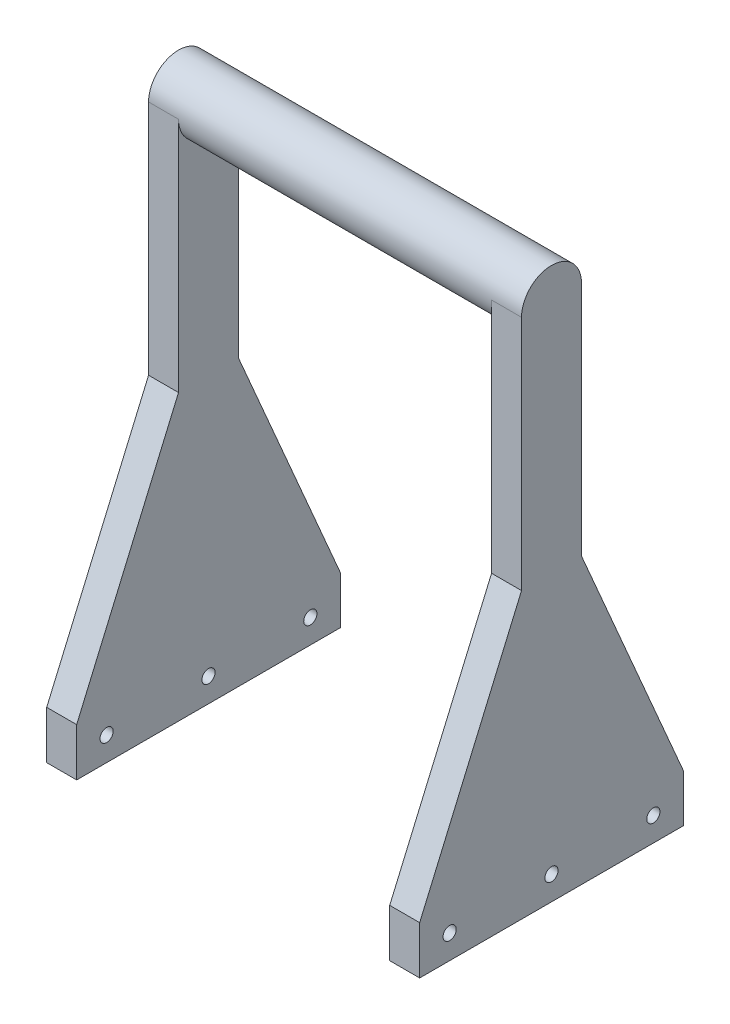
ISO-10303-21;
HEADER;
FILE_DESCRIPTION(('STEP AP214'),'2;1');
FILE_NAME('part.step','',(''),(''),'','','');
FILE_SCHEMA(('AUTOMOTIVE_DESIGN { 1 0 10303 214 1 1 1 1 }'));
ENDSEC;
DATA;
#1=APPLICATION_CONTEXT('core data for automotive mechanical design processes');
#2=APPLICATION_PROTOCOL_DEFINITION('international standard','automotive_design',2000,#1);
#3=PRODUCT_CONTEXT('',#1,'mechanical');
#4=PRODUCT('Part','Part','',(#3));
#5=PRODUCT_RELATED_PRODUCT_CATEGORY('part','',(#4));
#6=PRODUCT_DEFINITION_FORMATION('','',#4);
#7=PRODUCT_DEFINITION_CONTEXT('part definition',#1,'design');
#8=PRODUCT_DEFINITION('design','',#6,#7);
#9=PRODUCT_DEFINITION_SHAPE('','',#8);
#10=(LENGTH_UNIT() NAMED_UNIT(*) SI_UNIT(.MILLI.,.METRE.));
#11=(NAMED_UNIT(*) PLANE_ANGLE_UNIT() SI_UNIT($,.RADIAN.));
#12=(NAMED_UNIT(*) SI_UNIT($,.STERADIAN.) SOLID_ANGLE_UNIT());
#13=UNCERTAINTY_MEASURE_WITH_UNIT(LENGTH_MEASURE(1.E-05),#10,'distance_accuracy_value','');
#14=(GEOMETRIC_REPRESENTATION_CONTEXT(3) GLOBAL_UNCERTAINTY_ASSIGNED_CONTEXT((#13)) GLOBAL_UNIT_ASSIGNED_CONTEXT((#10,
#11,#12)) REPRESENTATION_CONTEXT('',''));
#15=CARTESIAN_POINT('',(0.,0.,0.));
#16=DIRECTION('',(0.,0.,1.));
#17=DIRECTION('',(1.,0.,0.));
#18=AXIS2_PLACEMENT_3D('',#15,#16,#17);
#19=CARTESIAN_POINT('',(62.25,174.,0.));
#20=DIRECTION('',(-1.,0.,0.));
#21=DIRECTION('',(0.,0.,1.));
#22=AXIS2_PLACEMENT_3D('',#19,#20,#21);
#23=CYLINDRICAL_SURFACE('',#22,10.);
#24=CARTESIAN_POINT('',(-52.25,174.,0.));
#25=DIRECTION('',(-1.,0.,0.));
#26=DIRECTION('',(0.,0.,1.));
#27=AXIS2_PLACEMENT_3D('',#24,#25,#26);
#28=CIRCLE('',#27,10.);
#29=CARTESIAN_POINT('',(-52.25,174.,-10.));
#30=VERTEX_POINT('',#29);
#31=CARTESIAN_POINT('',(-52.25,174.,10.));
#32=VERTEX_POINT('',#31);
#33=EDGE_CURVE('E215',#30,#32,#28,.T.);
#34=ORIENTED_EDGE('',*,*,#33,.F.);
#35=DIRECTION('',(-1.,0.,0.));
#36=VECTOR('',#35,1.);
#37=CARTESIAN_POINT('',(-62.25,174.,-10.));
#38=LINE('',#37,#36);
#39=CARTESIAN_POINT('',(-62.25,174.,-10.));
#40=VERTEX_POINT('',#39);
#41=EDGE_CURVE('E222',#30,#40,#38,.T.);
#42=ORIENTED_EDGE('',*,*,#41,.T.);
#43=CARTESIAN_POINT('',(-62.25,174.,0.));
#44=DIRECTION('',(-1.,0.,0.));
#45=DIRECTION('',(0.,0.,1.));
#46=AXIS2_PLACEMENT_3D('',#43,#44,#45);
#47=CIRCLE('',#46,10.);
#48=CARTESIAN_POINT('',(-62.25,174.,10.));
#49=VERTEX_POINT('',#48);
#50=EDGE_CURVE('E208',#49,#40,#47,.T.);
#51=ORIENTED_EDGE('',*,*,#50,.F.);
#52=DIRECTION('',(1.,0.,0.));
#53=VECTOR('',#52,1.);
#54=CARTESIAN_POINT('',(-62.25,174.,10.));
#55=LINE('',#54,#53);
#56=EDGE_CURVE('E219',#49,#32,#55,.T.);
#57=ORIENTED_EDGE('',*,*,#56,.T.);
#58=EDGE_LOOP('',(#34,#42,#51,#57));
#59=FACE_BOUND('',#58,.T.);
#60=CARTESIAN_POINT('',(52.25,174.,0.));
#61=DIRECTION('',(1.,0.,0.));
#62=DIRECTION('',(0.,0.,-1.));
#63=AXIS2_PLACEMENT_3D('',#60,#61,#62);
#64=CIRCLE('',#63,10.);
#65=CARTESIAN_POINT('',(52.25,174.,-10.));
#66=VERTEX_POINT('',#65);
#67=CARTESIAN_POINT('',(52.25,174.,9.99999999999999));
#68=VERTEX_POINT('',#67);
#69=EDGE_CURVE('E11',#66,#68,#64,.F.);
#70=ORIENTED_EDGE('',*,*,#69,.T.);
#71=DIRECTION('',(1.,0.,0.));
#72=VECTOR('',#71,1.);
#73=CARTESIAN_POINT('',(62.25,174.,9.99999999999999));
#74=LINE('',#73,#72);
#75=CARTESIAN_POINT('',(62.25,174.,9.99999999999999));
#76=VERTEX_POINT('',#75);
#77=EDGE_CURVE('E175',#68,#76,#74,.T.);
#78=ORIENTED_EDGE('',*,*,#77,.T.);
#79=CARTESIAN_POINT('',(62.25,174.,0.));
#80=DIRECTION('',(-1.,0.,0.));
#81=DIRECTION('',(0.,0.,1.));
#82=AXIS2_PLACEMENT_3D('',#79,#80,#81);
#83=CIRCLE('',#82,10.);
#84=CARTESIAN_POINT('',(62.25,174.,-10.));
#85=VERTEX_POINT('',#84);
#86=EDGE_CURVE('E212',#76,#85,#83,.T.);
#87=ORIENTED_EDGE('',*,*,#86,.T.);
#88=DIRECTION('',(-1.,0.,0.));
#89=VECTOR('',#88,1.);
#90=CARTESIAN_POINT('',(62.25,174.,-10.));
#91=LINE('',#90,#89);
#92=EDGE_CURVE('E184',#85,#66,#91,.T.);
#93=ORIENTED_EDGE('',*,*,#92,.T.);
#94=EDGE_LOOP('',(#70,#78,#87,#93));
#95=FACE_BOUND('',#94,.T.);
#96=ADVANCED_FACE('F39',(#59,#95),#23,.T.);
#97=CARTESIAN_POINT('',(-52.25,16.,-44.));
#98=DIRECTION('',(-1.,0.,0.));
#99=DIRECTION('',(0.,0.,1.));
#100=AXIS2_PLACEMENT_3D('',#97,#98,#99);
#101=PLANE('',#100);
#102=DIRECTION('',(0.,-1.,0.));
#103=VECTOR('',#102,1.);
#104=CARTESIAN_POINT('',(-52.25,16.,-44.));
#105=LINE('',#104,#103);
#106=CARTESIAN_POINT('',(-52.25,16.,-44.));
#107=VERTEX_POINT('',#106);
#108=CARTESIAN_POINT('',(-52.25,0.,-44.));
#109=VERTEX_POINT('',#108);
#110=EDGE_CURVE('E48',#107,#109,#105,.T.);
#111=ORIENTED_EDGE('',*,*,#110,.F.);
#112=DIRECTION('',(0.,-0.918542556009364,-0.395322112712891));
#113=VECTOR('',#112,1.);
#114=CARTESIAN_POINT('',(-52.25,16.,-44.));
#115=LINE('',#114,#113);
#116=CARTESIAN_POINT('',(-52.25,95.,-9.99999999999999));
#117=VERTEX_POINT('',#116);
#118=EDGE_CURVE('E433',#117,#107,#115,.T.);
#119=ORIENTED_EDGE('',*,*,#118,.F.);
#120=DIRECTION('',(0.,-1.,0.));
#121=VECTOR('',#120,1.);
#122=CARTESIAN_POINT('',(-52.25,174.,-10.));
#123=LINE('',#122,#121);
#124=EDGE_CURVE('E228',#30,#117,#123,.T.);
#125=ORIENTED_EDGE('',*,*,#124,.F.);
#126=ORIENTED_EDGE('',*,*,#33,.T.);
#127=DIRECTION('',(0.,-1.,0.));
#128=VECTOR('',#127,1.);
#129=CARTESIAN_POINT('',(-52.25,174.,10.));
#130=LINE('',#129,#128);
#131=CARTESIAN_POINT('',(-52.25,95.,10.));
#132=VERTEX_POINT('',#131);
#133=EDGE_CURVE('E231',#32,#132,#130,.T.);
#134=ORIENTED_EDGE('',*,*,#133,.T.);
#135=DIRECTION('',(0.,0.918542556009365,-0.395322112712891));
#136=VECTOR('',#135,1.);
#137=CARTESIAN_POINT('',(-52.25,16.,44.));
#138=LINE('',#137,#136);
#139=CARTESIAN_POINT('',(-52.25,16.,44.));
#140=VERTEX_POINT('',#139);
#141=EDGE_CURVE('E365',#140,#132,#138,.T.);
#142=ORIENTED_EDGE('',*,*,#141,.F.);
#143=DIRECTION('',(0.,-1.,0.));
#144=VECTOR('',#143,1.);
#145=CARTESIAN_POINT('',(-52.25,16.,44.));
#146=LINE('',#145,#144);
#147=CARTESIAN_POINT('',(-52.25,0.,44.));
#148=VERTEX_POINT('',#147);
#149=EDGE_CURVE('E243',#140,#148,#146,.T.);
#150=ORIENTED_EDGE('',*,*,#149,.T.);
#151=DIRECTION('',(0.,0.,-1.));
#152=VECTOR('',#151,1.);
#153=CARTESIAN_POINT('',(-52.25,0.,-44.));
#154=LINE('',#153,#152);
#155=EDGE_CURVE('E236',#148,#109,#154,.T.);
#156=ORIENTED_EDGE('',*,*,#155,.T.);
#157=EDGE_LOOP('',(#111,#119,#125,#126,#134,#142,#150,#156));
#158=FACE_BOUND('',#157,.T.);
#159=CARTESIAN_POINT('',(-52.25,8.00000000000001,34.));
#160=DIRECTION('',(-1.,0.,0.));
#161=DIRECTION('',(0.,0.,1.));
#162=AXIS2_PLACEMENT_3D('',#159,#160,#161);
#163=CIRCLE('',#162,2.2);
#164=CARTESIAN_POINT('',(-52.25,8.00000000000001,36.2));
#165=VERTEX_POINT('',#164);
#166=EDGE_CURVE('E287',#165,#165,#163,.T.);
#167=ORIENTED_EDGE('',*,*,#166,.T.);
#168=EDGE_LOOP('',(#167));
#169=FACE_BOUND('',#168,.T.);
#170=CARTESIAN_POINT('',(-52.25,8.00000000000001,-34.));
#171=DIRECTION('',(-1.,0.,0.));
#172=DIRECTION('',(0.,0.,1.));
#173=AXIS2_PLACEMENT_3D('',#170,#171,#172);
#174=CIRCLE('',#173,2.2);
#175=CARTESIAN_POINT('',(-52.25,8.00000000000001,-31.8));
#176=VERTEX_POINT('',#175);
#177=EDGE_CURVE('E272',#176,#176,#174,.T.);
#178=ORIENTED_EDGE('',*,*,#177,.T.);
#179=EDGE_LOOP('',(#178));
#180=FACE_BOUND('',#179,.T.);
#181=CARTESIAN_POINT('',(-52.25,8.,0.));
#182=DIRECTION('',(-1.,0.,0.));
#183=DIRECTION('',(0.,0.,1.));
#184=AXIS2_PLACEMENT_3D('',#181,#182,#183);
#185=CIRCLE('',#184,2.2);
#186=CARTESIAN_POINT('',(-52.25,8.,2.2));
#187=VERTEX_POINT('',#186);
#188=EDGE_CURVE('E268',#187,#187,#185,.T.);
#189=ORIENTED_EDGE('',*,*,#188,.T.);
#190=EDGE_LOOP('',(#189));
#191=FACE_BOUND('',#190,.T.);
#192=ADVANCED_FACE('F41',(#158,#169,#180,#191),#101,.F.);
#193=CARTESIAN_POINT('',(-62.25,16.,-44.));
#194=DIRECTION('',(0.,0.,1.));
#195=DIRECTION('',(1.,0.,0.));
#196=AXIS2_PLACEMENT_3D('',#193,#194,#195);
#197=PLANE('',#196);
#198=DIRECTION('',(-1.,0.,0.));
#199=VECTOR('',#198,1.);
#200=CARTESIAN_POINT('',(-62.25,0.,-44.));
#201=LINE('',#200,#199);
#202=CARTESIAN_POINT('',(-62.25,0.,-44.));
#203=VERTEX_POINT('',#202);
#204=EDGE_CURVE('E246',#109,#203,#201,.T.);
#205=ORIENTED_EDGE('',*,*,#204,.T.);
#206=DIRECTION('',(0.,-1.,0.));
#207=VECTOR('',#206,1.);
#208=CARTESIAN_POINT('',(-62.25,16.,-44.));
#209=LINE('',#208,#207);
#210=CARTESIAN_POINT('',(-62.25,16.,-44.));
#211=VERTEX_POINT('',#210);
#212=EDGE_CURVE('E256',#211,#203,#209,.T.);
#213=ORIENTED_EDGE('',*,*,#212,.F.);
#214=DIRECTION('',(-1.,0.,0.));
#215=VECTOR('',#214,1.);
#216=CARTESIAN_POINT('',(-62.25,16.,-44.));
#217=LINE('',#216,#215);
#218=EDGE_CURVE('E237',#107,#211,#217,.T.);
#219=ORIENTED_EDGE('',*,*,#218,.F.);
#220=ORIENTED_EDGE('',*,*,#110,.T.);
#221=EDGE_LOOP('',(#205,#213,#219,#220));
#222=FACE_BOUND('',#221,.T.);
#223=ADVANCED_FACE('F323',(#222),#197,.F.);
#224=CARTESIAN_POINT('',(-62.25,16.,-44.));
#225=DIRECTION('',(1.,0.,0.));
#226=DIRECTION('',(0.,0.,-1.));
#227=AXIS2_PLACEMENT_3D('',#224,#225,#226);
#228=PLANE('',#227);
#229=DIRECTION('',(0.,-1.,0.));
#230=VECTOR('',#229,1.);
#231=CARTESIAN_POINT('',(-62.25,16.,44.));
#232=LINE('',#231,#230);
#233=CARTESIAN_POINT('',(-62.25,16.,44.));
#234=VERTEX_POINT('',#233);
#235=CARTESIAN_POINT('',(-62.25,0.,44.));
#236=VERTEX_POINT('',#235);
#237=EDGE_CURVE('E253',#234,#236,#232,.T.);
#238=ORIENTED_EDGE('',*,*,#237,.F.);
#239=DIRECTION('',(0.,0.918542556009365,-0.395322112712891));
#240=VECTOR('',#239,1.);
#241=CARTESIAN_POINT('',(-62.25,16.,44.));
#242=LINE('',#241,#240);
#243=CARTESIAN_POINT('',(-62.25,95.,10.));
#244=VERTEX_POINT('',#243);
#245=EDGE_CURVE('E369',#234,#244,#242,.T.);
#246=ORIENTED_EDGE('',*,*,#245,.T.);
#247=DIRECTION('',(0.,-1.,0.));
#248=VECTOR('',#247,1.);
#249=CARTESIAN_POINT('',(-62.25,174.,10.));
#250=LINE('',#249,#248);
#251=EDGE_CURVE('E234',#49,#244,#250,.T.);
#252=ORIENTED_EDGE('',*,*,#251,.F.);
#253=ORIENTED_EDGE('',*,*,#50,.T.);
#254=DIRECTION('',(0.,-1.,0.));
#255=VECTOR('',#254,1.);
#256=CARTESIAN_POINT('',(-62.25,174.,-10.));
#257=LINE('',#256,#255);
#258=CARTESIAN_POINT('',(-62.25,95.,-10.));
#259=VERTEX_POINT('',#258);
#260=EDGE_CURVE('E225',#40,#259,#257,.T.);
#261=ORIENTED_EDGE('',*,*,#260,.T.);
#262=DIRECTION('',(0.,-0.918542556009364,-0.395322112712891));
#263=VECTOR('',#262,1.);
#264=CARTESIAN_POINT('',(-62.25,16.,-44.));
#265=LINE('',#264,#263);
#266=EDGE_CURVE('E360',#259,#211,#265,.T.);
#267=ORIENTED_EDGE('',*,*,#266,.T.);
#268=ORIENTED_EDGE('',*,*,#212,.T.);
#269=DIRECTION('',(0.,0.,1.));
#270=VECTOR('',#269,1.);
#271=CARTESIAN_POINT('',(-62.25,0.,-44.));
#272=LINE('',#271,#270);
#273=EDGE_CURVE('E248',#203,#236,#272,.T.);
#274=ORIENTED_EDGE('',*,*,#273,.T.);
#275=EDGE_LOOP('',(#238,#246,#252,#253,#261,#267,#268,#274));
#276=FACE_BOUND('',#275,.T.);
#277=CARTESIAN_POINT('',(-62.25,8.00000000000001,34.));
#278=DIRECTION('',(-1.,0.,0.));
#279=DIRECTION('',(0.,0.,1.));
#280=AXIS2_PLACEMENT_3D('',#277,#278,#279);
#281=CIRCLE('',#280,2.2);
#282=CARTESIAN_POINT('',(-62.25,8.00000000000001,36.2));
#283=VERTEX_POINT('',#282);
#284=EDGE_CURVE('E378',#283,#283,#281,.T.);
#285=ORIENTED_EDGE('',*,*,#284,.F.);
#286=EDGE_LOOP('',(#285));
#287=FACE_BOUND('',#286,.T.);
#288=CARTESIAN_POINT('',(-62.25,8.00000000000001,-34.));
#289=DIRECTION('',(-1.,0.,0.));
#290=DIRECTION('',(0.,0.,1.));
#291=AXIS2_PLACEMENT_3D('',#288,#289,#290);
#292=CIRCLE('',#291,2.2);
#293=CARTESIAN_POINT('',(-62.25,8.00000000000001,-31.8));
#294=VERTEX_POINT('',#293);
#295=EDGE_CURVE('E375',#294,#294,#292,.T.);
#296=ORIENTED_EDGE('',*,*,#295,.F.);
#297=EDGE_LOOP('',(#296));
#298=FACE_BOUND('',#297,.T.);
#299=CARTESIAN_POINT('',(-62.25,8.,0.));
#300=DIRECTION('',(-1.,0.,0.));
#301=DIRECTION('',(0.,0.,1.));
#302=AXIS2_PLACEMENT_3D('',#299,#300,#301);
#303=CIRCLE('',#302,2.2);
#304=CARTESIAN_POINT('',(-62.25,8.,2.2));
#305=VERTEX_POINT('',#304);
#306=EDGE_CURVE('E264',#305,#305,#303,.T.);
#307=ORIENTED_EDGE('',*,*,#306,.F.);
#308=EDGE_LOOP('',(#307));
#309=FACE_BOUND('',#308,.T.);
#310=ADVANCED_FACE('F345',(#276,#287,#298,#309),#228,.F.);
#311=CARTESIAN_POINT('',(-62.25,16.,44.));
#312=DIRECTION('',(0.,0.,-1.));
#313=DIRECTION('',(-1.,0.,0.));
#314=AXIS2_PLACEMENT_3D('',#311,#312,#313);
#315=PLANE('',#314);
#316=DIRECTION('',(1.,0.,0.));
#317=VECTOR('',#316,1.);
#318=CARTESIAN_POINT('',(-62.25,0.,44.));
#319=LINE('',#318,#317);
#320=EDGE_CURVE('E240',#236,#148,#319,.T.);
#321=ORIENTED_EDGE('',*,*,#320,.T.);
#322=ORIENTED_EDGE('',*,*,#149,.F.);
#323=DIRECTION('',(1.,0.,0.));
#324=VECTOR('',#323,1.);
#325=CARTESIAN_POINT('',(-62.25,16.,44.));
#326=LINE('',#325,#324);
#327=EDGE_CURVE('E239',#234,#140,#326,.T.);
#328=ORIENTED_EDGE('',*,*,#327,.F.);
#329=ORIENTED_EDGE('',*,*,#237,.T.);
#330=EDGE_LOOP('',(#321,#322,#328,#329));
#331=FACE_BOUND('',#330,.T.);
#332=ADVANCED_FACE('F341',(#331),#315,.F.);
#333=CARTESIAN_POINT('',(0.,0.,0.));
#334=DIRECTION('',(0.,1.,0.));
#335=DIRECTION('',(0.,0.,1.));
#336=AXIS2_PLACEMENT_3D('',#333,#334,#335);
#337=PLANE('',#336);
#338=ORIENTED_EDGE('',*,*,#155,.F.);
#339=ORIENTED_EDGE('',*,*,#320,.F.);
#340=ORIENTED_EDGE('',*,*,#273,.F.);
#341=ORIENTED_EDGE('',*,*,#204,.F.);
#342=EDGE_LOOP('',(#338,#339,#340,#341));
#343=FACE_BOUND('',#342,.T.);
#344=ADVANCED_FACE('F338',(#343),#337,.F.);
#345=CARTESIAN_POINT('',(-62.25,174.,10.));
#346=DIRECTION('',(0.,0.,-1.));
#347=DIRECTION('',(-1.,0.,0.));
#348=AXIS2_PLACEMENT_3D('',#345,#346,#347);
#349=PLANE('',#348);
#350=ORIENTED_EDGE('',*,*,#251,.T.);
#351=DIRECTION('',(-1.,0.,0.));
#352=VECTOR('',#351,1.);
#353=CARTESIAN_POINT('',(-52.25,95.,9.99999999999999));
#354=LINE('',#353,#352);
#355=EDGE_CURVE('E161',#132,#244,#354,.T.);
#356=ORIENTED_EDGE('',*,*,#355,.F.);
#357=ORIENTED_EDGE('',*,*,#133,.F.);
#358=ORIENTED_EDGE('',*,*,#56,.F.);
#359=EDGE_LOOP('',(#350,#356,#357,#358));
#360=FACE_BOUND('',#359,.T.);
#361=ADVANCED_FACE('F334',(#360),#349,.F.);
#362=CARTESIAN_POINT('',(-62.25,174.,-10.));
#363=DIRECTION('',(0.,0.,1.));
#364=DIRECTION('',(1.,0.,0.));
#365=AXIS2_PLACEMENT_3D('',#362,#363,#364);
#366=PLANE('',#365);
#367=ORIENTED_EDGE('',*,*,#124,.T.);
#368=DIRECTION('',(-1.,0.,0.));
#369=VECTOR('',#368,1.);
#370=CARTESIAN_POINT('',(-52.25,95.,-9.99999999999999));
#371=LINE('',#370,#369);
#372=EDGE_CURVE('E379',#117,#259,#371,.T.);
#373=ORIENTED_EDGE('',*,*,#372,.T.);
#374=ORIENTED_EDGE('',*,*,#260,.F.);
#375=ORIENTED_EDGE('',*,*,#41,.F.);
#376=EDGE_LOOP('',(#367,#373,#374,#375));
#377=FACE_BOUND('',#376,.T.);
#378=ADVANCED_FACE('F331',(#377),#366,.F.);
#379=CARTESIAN_POINT('',(62.25,174.,0.));
#380=DIRECTION('',(-1.,0.,0.));
#381=DIRECTION('',(0.,0.,1.));
#382=AXIS2_PLACEMENT_3D('',#379,#380,#381);
#383=PLANE('',#382);
#384=DIRECTION('',(0.,-1.,0.));
#385=VECTOR('',#384,1.);
#386=CARTESIAN_POINT('',(62.25,16.,-44.));
#387=LINE('',#386,#385);
#388=CARTESIAN_POINT('',(62.25,16.,-44.));
#389=VERTEX_POINT('',#388);
#390=CARTESIAN_POINT('',(62.25,0.,-44.));
#391=VERTEX_POINT('',#390);
#392=EDGE_CURVE('E187',#389,#391,#387,.T.);
#393=ORIENTED_EDGE('',*,*,#392,.F.);
#394=DIRECTION('',(0.,0.918542556009365,0.395322112712891));
#395=VECTOR('',#394,1.);
#396=CARTESIAN_POINT('',(62.25,16.,-44.));
#397=LINE('',#396,#395);
#398=CARTESIAN_POINT('',(62.25,95.,-10.));
#399=VERTEX_POINT('',#398);
#400=EDGE_CURVE('E421',#389,#399,#397,.T.);
#401=ORIENTED_EDGE('',*,*,#400,.T.);
#402=DIRECTION('',(0.,-1.,0.));
#403=VECTOR('',#402,1.);
#404=CARTESIAN_POINT('',(62.25,174.,-10.));
#405=LINE('',#404,#403);
#406=EDGE_CURVE('E56',#85,#399,#405,.T.);
#407=ORIENTED_EDGE('',*,*,#406,.F.);
#408=ORIENTED_EDGE('',*,*,#86,.F.);
#409=DIRECTION('',(0.,-1.,0.));
#410=VECTOR('',#409,1.);
#411=CARTESIAN_POINT('',(62.25,174.,9.99999999999999));
#412=LINE('',#411,#410);
#413=CARTESIAN_POINT('',(62.25,95.,9.99999999999999));
#414=VERTEX_POINT('',#413);
#415=EDGE_CURVE('E176',#76,#414,#412,.T.);
#416=ORIENTED_EDGE('',*,*,#415,.T.);
#417=DIRECTION('',(0.,-0.918542556009365,0.395322112712891));
#418=VECTOR('',#417,1.);
#419=CARTESIAN_POINT('',(62.25,16.,44.));
#420=LINE('',#419,#418);
#421=CARTESIAN_POINT('',(62.25,16.,44.));
#422=VERTEX_POINT('',#421);
#423=EDGE_CURVE('E157',#414,#422,#420,.T.);
#424=ORIENTED_EDGE('',*,*,#423,.T.);
#425=DIRECTION('',(0.,-1.,0.));
#426=VECTOR('',#425,1.);
#427=CARTESIAN_POINT('',(62.25,16.,44.));
#428=LINE('',#427,#426);
#429=CARTESIAN_POINT('',(62.25,0.,44.));
#430=VERTEX_POINT('',#429);
#431=EDGE_CURVE('E194',#422,#430,#428,.T.);
#432=ORIENTED_EDGE('',*,*,#431,.T.);
#433=DIRECTION('',(0.,0.,-1.));
#434=VECTOR('',#433,1.);
#435=CARTESIAN_POINT('',(62.25,0.,-44.));
#436=LINE('',#435,#434);
#437=EDGE_CURVE('E205',#430,#391,#436,.T.);
#438=ORIENTED_EDGE('',*,*,#437,.T.);
#439=EDGE_LOOP('',(#393,#401,#407,#408,#416,#424,#432,#438));
#440=FACE_BOUND('',#439,.T.);
#441=CARTESIAN_POINT('',(62.25,8.00000000000001,34.));
#442=DIRECTION('',(-1.,0.,0.));
#443=DIRECTION('',(0.,0.,1.));
#444=AXIS2_PLACEMENT_3D('',#441,#442,#443);
#445=CIRCLE('',#444,2.2);
#446=CARTESIAN_POINT('',(62.25,8.00000000000001,36.2));
#447=VERTEX_POINT('',#446);
#448=EDGE_CURVE('E284',#447,#447,#445,.T.);
#449=ORIENTED_EDGE('',*,*,#448,.T.);
#450=EDGE_LOOP('',(#449));
#451=FACE_BOUND('',#450,.T.);
#452=CARTESIAN_POINT('',(62.25,8.00000000000001,-34.));
#453=DIRECTION('',(-1.,0.,0.));
#454=DIRECTION('',(0.,0.,1.));
#455=AXIS2_PLACEMENT_3D('',#452,#453,#454);
#456=CIRCLE('',#455,2.2);
#457=CARTESIAN_POINT('',(62.25,8.00000000000001,-31.8));
#458=VERTEX_POINT('',#457);
#459=EDGE_CURVE('E267',#458,#458,#456,.T.);
#460=ORIENTED_EDGE('',*,*,#459,.T.);
#461=EDGE_LOOP('',(#460));
#462=FACE_BOUND('',#461,.T.);
#463=CARTESIAN_POINT('',(62.25,8.,0.));
#464=DIRECTION('',(-1.,0.,0.));
#465=DIRECTION('',(0.,0.,1.));
#466=AXIS2_PLACEMENT_3D('',#463,#464,#465);
#467=CIRCLE('',#466,2.2);
#468=CARTESIAN_POINT('',(62.25,8.,2.20000000000001));
#469=VERTEX_POINT('',#468);
#470=EDGE_CURVE('E263',#469,#469,#467,.T.);
#471=ORIENTED_EDGE('',*,*,#470,.T.);
#472=EDGE_LOOP('',(#471));
#473=FACE_BOUND('',#472,.T.);
#474=ADVANCED_FACE('F329',(#440,#451,#462,#473),#383,.F.);
#475=CARTESIAN_POINT('',(52.25,16.,-44.));
#476=DIRECTION('',(0.,0.,1.));
#477=DIRECTION('',(1.,0.,0.));
#478=AXIS2_PLACEMENT_3D('',#475,#476,#477);
#479=PLANE('',#478);
#480=DIRECTION('',(-1.,0.,0.));
#481=VECTOR('',#480,1.);
#482=CARTESIAN_POINT('',(52.25,0.,-44.));
#483=LINE('',#482,#481);
#484=CARTESIAN_POINT('',(52.25,0.,-44.));
#485=VERTEX_POINT('',#484);
#486=EDGE_CURVE('E203',#391,#485,#483,.T.);
#487=ORIENTED_EDGE('',*,*,#486,.T.);
#488=DIRECTION('',(0.,-1.,0.));
#489=VECTOR('',#488,1.);
#490=CARTESIAN_POINT('',(52.25,16.,-44.));
#491=LINE('',#490,#489);
#492=CARTESIAN_POINT('',(52.25,16.,-44.));
#493=VERTEX_POINT('',#492);
#494=EDGE_CURVE('E190',#493,#485,#491,.T.);
#495=ORIENTED_EDGE('',*,*,#494,.F.);
#496=DIRECTION('',(-1.,0.,0.));
#497=VECTOR('',#496,1.);
#498=CARTESIAN_POINT('',(52.25,16.,-44.));
#499=LINE('',#498,#497);
#500=EDGE_CURVE('E201',#389,#493,#499,.T.);
#501=ORIENTED_EDGE('',*,*,#500,.F.);
#502=ORIENTED_EDGE('',*,*,#392,.T.);
#503=EDGE_LOOP('',(#487,#495,#501,#502));
#504=FACE_BOUND('',#503,.T.);
#505=ADVANCED_FACE('F404',(#504),#479,.F.);
#506=CARTESIAN_POINT('',(52.25,16.,-44.));
#507=DIRECTION('',(1.,0.,0.));
#508=DIRECTION('',(0.,0.,-1.));
#509=AXIS2_PLACEMENT_3D('',#506,#507,#508);
#510=PLANE('',#509);
#511=DIRECTION('',(0.,-1.,0.));
#512=VECTOR('',#511,1.);
#513=CARTESIAN_POINT('',(52.25,16.,44.));
#514=LINE('',#513,#512);
#515=CARTESIAN_POINT('',(52.25,16.,44.));
#516=VERTEX_POINT('',#515);
#517=CARTESIAN_POINT('',(52.25,0.,44.));
#518=VERTEX_POINT('',#517);
#519=EDGE_CURVE('E170',#516,#518,#514,.T.);
#520=ORIENTED_EDGE('',*,*,#519,.F.);
#521=DIRECTION('',(0.,-0.918542556009365,0.395322112712891));
#522=VECTOR('',#521,1.);
#523=CARTESIAN_POINT('',(52.25,16.,44.));
#524=LINE('',#523,#522);
#525=CARTESIAN_POINT('',(52.25,95.,9.99999999999999));
#526=VERTEX_POINT('',#525);
#527=EDGE_CURVE('E154',#526,#516,#524,.T.);
#528=ORIENTED_EDGE('',*,*,#527,.F.);
#529=DIRECTION('',(0.,-1.,0.));
#530=VECTOR('',#529,1.);
#531=CARTESIAN_POINT('',(52.25,174.,9.99999999999999));
#532=LINE('',#531,#530);
#533=EDGE_CURVE('E167',#68,#526,#532,.T.);
#534=ORIENTED_EDGE('',*,*,#533,.F.);
#535=ORIENTED_EDGE('',*,*,#69,.F.);
#536=DIRECTION('',(0.,-1.,0.));
#537=VECTOR('',#536,1.);
#538=CARTESIAN_POINT('',(52.25,174.,-10.));
#539=LINE('',#538,#537);
#540=CARTESIAN_POINT('',(52.25,95.,-10.));
#541=VERTEX_POINT('',#540);
#542=EDGE_CURVE('E177',#66,#541,#539,.T.);
#543=ORIENTED_EDGE('',*,*,#542,.T.);
#544=DIRECTION('',(0.,0.918542556009365,0.395322112712891));
#545=VECTOR('',#544,1.);
#546=CARTESIAN_POINT('',(52.25,16.,-44.));
#547=LINE('',#546,#545);
#548=EDGE_CURVE('E427',#493,#541,#547,.T.);
#549=ORIENTED_EDGE('',*,*,#548,.F.);
#550=ORIENTED_EDGE('',*,*,#494,.T.);
#551=DIRECTION('',(0.,0.,1.));
#552=VECTOR('',#551,1.);
#553=CARTESIAN_POINT('',(52.25,0.,-44.));
#554=LINE('',#553,#552);
#555=EDGE_CURVE('E200',#485,#518,#554,.T.);
#556=ORIENTED_EDGE('',*,*,#555,.T.);
#557=EDGE_LOOP('',(#520,#528,#534,#535,#543,#549,#550,#556));
#558=FACE_BOUND('',#557,.T.);
#559=CARTESIAN_POINT('',(52.25,8.00000000000001,34.));
#560=DIRECTION('',(1.,0.,0.));
#561=DIRECTION('',(0.,0.,-1.));
#562=AXIS2_PLACEMENT_3D('',#559,#560,#561);
#563=CIRCLE('',#562,2.2);
#564=CARTESIAN_POINT('',(52.25,8.00000000000001,31.8));
#565=VERTEX_POINT('',#564);
#566=EDGE_CURVE('E43',#565,#565,#563,.T.);
#567=ORIENTED_EDGE('',*,*,#566,.T.);
#568=EDGE_LOOP('',(#567));
#569=FACE_BOUND('',#568,.T.);
#570=CARTESIAN_POINT('',(52.25,8.00000000000001,-34.));
#571=DIRECTION('',(1.,0.,0.));
#572=DIRECTION('',(0.,0.,-1.));
#573=AXIS2_PLACEMENT_3D('',#570,#571,#572);
#574=CIRCLE('',#573,2.2);
#575=CARTESIAN_POINT('',(52.25,8.00000000000001,-36.2));
#576=VERTEX_POINT('',#575);
#577=EDGE_CURVE('E265',#576,#576,#574,.T.);
#578=ORIENTED_EDGE('',*,*,#577,.T.);
#579=EDGE_LOOP('',(#578));
#580=FACE_BOUND('',#579,.T.);
#581=CARTESIAN_POINT('',(52.25,8.,0.));
#582=DIRECTION('',(1.,0.,0.));
#583=DIRECTION('',(0.,0.,-1.));
#584=AXIS2_PLACEMENT_3D('',#581,#582,#583);
#585=CIRCLE('',#584,2.2);
#586=CARTESIAN_POINT('',(52.25,8.,-2.19999999999999));
#587=VERTEX_POINT('',#586);
#588=EDGE_CURVE('E261',#587,#587,#585,.T.);
#589=ORIENTED_EDGE('',*,*,#588,.T.);
#590=EDGE_LOOP('',(#589));
#591=FACE_BOUND('',#590,.T.);
#592=ADVANCED_FACE('F164',(#558,#569,#580,#591),#510,.F.);
#593=CARTESIAN_POINT('',(52.25,16.,44.));
#594=DIRECTION('',(0.,0.,-1.));
#595=DIRECTION('',(-1.,0.,0.));
#596=AXIS2_PLACEMENT_3D('',#593,#594,#595);
#597=PLANE('',#596);
#598=DIRECTION('',(1.,0.,0.));
#599=VECTOR('',#598,1.);
#600=CARTESIAN_POINT('',(52.25,0.,44.));
#601=LINE('',#600,#599);
#602=EDGE_CURVE('E198',#518,#430,#601,.T.);
#603=ORIENTED_EDGE('',*,*,#602,.T.);
#604=ORIENTED_EDGE('',*,*,#431,.F.);
#605=DIRECTION('',(1.,0.,0.));
#606=VECTOR('',#605,1.);
#607=CARTESIAN_POINT('',(52.25,16.,44.));
#608=LINE('',#607,#606);
#609=EDGE_CURVE('E197',#516,#422,#608,.T.);
#610=ORIENTED_EDGE('',*,*,#609,.F.);
#611=ORIENTED_EDGE('',*,*,#519,.T.);
#612=EDGE_LOOP('',(#603,#604,#610,#611));
#613=FACE_BOUND('',#612,.T.);
#614=ADVANCED_FACE('F473',(#613),#597,.F.);
#615=CARTESIAN_POINT('',(0.,0.,0.));
#616=DIRECTION('',(0.,1.,0.));
#617=DIRECTION('',(0.,0.,1.));
#618=AXIS2_PLACEMENT_3D('',#615,#616,#617);
#619=PLANE('',#618);
#620=ORIENTED_EDGE('',*,*,#437,.F.);
#621=ORIENTED_EDGE('',*,*,#602,.F.);
#622=ORIENTED_EDGE('',*,*,#555,.F.);
#623=ORIENTED_EDGE('',*,*,#486,.F.);
#624=EDGE_LOOP('',(#620,#621,#622,#623));
#625=FACE_BOUND('',#624,.T.);
#626=ADVANCED_FACE('F469',(#625),#619,.F.);
#627=CARTESIAN_POINT('',(62.25,174.,-10.));
#628=DIRECTION('',(0.,0.,1.));
#629=DIRECTION('',(1.,0.,0.));
#630=AXIS2_PLACEMENT_3D('',#627,#628,#629);
#631=PLANE('',#630);
#632=ORIENTED_EDGE('',*,*,#406,.T.);
#633=DIRECTION('',(1.,0.,0.));
#634=VECTOR('',#633,1.);
#635=CARTESIAN_POINT('',(52.25,95.,-10.));
#636=LINE('',#635,#634);
#637=EDGE_CURVE('E60',#541,#399,#636,.T.);
#638=ORIENTED_EDGE('',*,*,#637,.F.);
#639=ORIENTED_EDGE('',*,*,#542,.F.);
#640=ORIENTED_EDGE('',*,*,#92,.F.);
#641=EDGE_LOOP('',(#632,#638,#639,#640));
#642=FACE_BOUND('',#641,.T.);
#643=ADVANCED_FACE('F397',(#642),#631,.F.);
#644=CARTESIAN_POINT('',(62.25,174.,9.99999999999999));
#645=DIRECTION('',(0.,0.,-1.));
#646=DIRECTION('',(-1.,0.,0.));
#647=AXIS2_PLACEMENT_3D('',#644,#645,#646);
#648=PLANE('',#647);
#649=ORIENTED_EDGE('',*,*,#533,.T.);
#650=DIRECTION('',(1.,0.,0.));
#651=VECTOR('',#650,1.);
#652=CARTESIAN_POINT('',(52.25,95.,9.99999999999999));
#653=LINE('',#652,#651);
#654=EDGE_CURVE('E151',#526,#414,#653,.T.);
#655=ORIENTED_EDGE('',*,*,#654,.T.);
#656=ORIENTED_EDGE('',*,*,#415,.F.);
#657=ORIENTED_EDGE('',*,*,#77,.F.);
#658=EDGE_LOOP('',(#649,#655,#656,#657));
#659=FACE_BOUND('',#658,.T.);
#660=ADVANCED_FACE('F173',(#659),#648,.F.);
#661=CARTESIAN_POINT('',(63.75,8.,0.));
#662=DIRECTION('',(-1.,0.,0.));
#663=DIRECTION('',(0.,0.,1.));
#664=AXIS2_PLACEMENT_3D('',#661,#662,#663);
#665=CYLINDRICAL_SURFACE('',#664,2.2);
#666=ORIENTED_EDGE('',*,*,#588,.F.);
#667=EDGE_LOOP('',(#666));
#668=FACE_BOUND('',#667,.T.);
#669=ORIENTED_EDGE('',*,*,#470,.F.);
#670=EDGE_LOOP('',(#669));
#671=FACE_BOUND('',#670,.T.);
#672=ADVANCED_FACE('F386',(#668,#671),#665,.F.);
#673=CARTESIAN_POINT('',(63.75,8.00000000000001,-34.));
#674=DIRECTION('',(-1.,0.,0.));
#675=DIRECTION('',(0.,0.,1.));
#676=AXIS2_PLACEMENT_3D('',#673,#674,#675);
#677=CYLINDRICAL_SURFACE('',#676,2.2);
#678=ORIENTED_EDGE('',*,*,#577,.F.);
#679=EDGE_LOOP('',(#678));
#680=FACE_BOUND('',#679,.T.);
#681=ORIENTED_EDGE('',*,*,#459,.F.);
#682=EDGE_LOOP('',(#681));
#683=FACE_BOUND('',#682,.T.);
#684=ADVANCED_FACE('F311',(#680,#683),#677,.F.);
#685=CARTESIAN_POINT('',(63.75,8.00000000000001,34.));
#686=DIRECTION('',(-1.,0.,0.));
#687=DIRECTION('',(0.,0.,1.));
#688=AXIS2_PLACEMENT_3D('',#685,#686,#687);
#689=CYLINDRICAL_SURFACE('',#688,2.2);
#690=ORIENTED_EDGE('',*,*,#566,.F.);
#691=EDGE_LOOP('',(#690));
#692=FACE_BOUND('',#691,.T.);
#693=ORIENTED_EDGE('',*,*,#448,.F.);
#694=EDGE_LOOP('',(#693));
#695=FACE_BOUND('',#694,.T.);
#696=ADVANCED_FACE('F299',(#692,#695),#689,.F.);
#697=ORIENTED_EDGE('',*,*,#306,.T.);
#698=EDGE_LOOP('',(#697));
#699=FACE_BOUND('',#698,.T.);
#700=ORIENTED_EDGE('',*,*,#188,.F.);
#701=EDGE_LOOP('',(#700));
#702=FACE_BOUND('',#701,.T.);
#703=ADVANCED_FACE('F308',(#699,#702),#665,.F.);
#704=ORIENTED_EDGE('',*,*,#295,.T.);
#705=EDGE_LOOP('',(#704));
#706=FACE_BOUND('',#705,.T.);
#707=ORIENTED_EDGE('',*,*,#177,.F.);
#708=EDGE_LOOP('',(#707));
#709=FACE_BOUND('',#708,.T.);
#710=ADVANCED_FACE('F296',(#706,#709),#677,.F.);
#711=ORIENTED_EDGE('',*,*,#284,.T.);
#712=EDGE_LOOP('',(#711));
#713=FACE_BOUND('',#712,.T.);
#714=ORIENTED_EDGE('',*,*,#166,.F.);
#715=EDGE_LOOP('',(#714));
#716=FACE_BOUND('',#715,.T.);
#717=ADVANCED_FACE('F293',(#713,#716),#689,.F.);
#718=CARTESIAN_POINT('',(-52.25,16.,-44.));
#719=DIRECTION('',(0.,0.395322112712891,-0.918542556009364));
#720=DIRECTION('',(0.,0.918542556009364,0.395322112712891));
#721=AXIS2_PLACEMENT_3D('',#718,#719,#720);
#722=PLANE('',#721);
#723=ORIENTED_EDGE('',*,*,#266,.F.);
#724=ORIENTED_EDGE('',*,*,#372,.F.);
#725=ORIENTED_EDGE('',*,*,#118,.T.);
#726=ORIENTED_EDGE('',*,*,#218,.T.);
#727=EDGE_LOOP('',(#723,#724,#725,#726));
#728=FACE_BOUND('',#727,.T.);
#729=ADVANCED_FACE('F295',(#728),#722,.T.);
#730=CARTESIAN_POINT('',(-52.25,16.,44.));
#731=DIRECTION('',(0.,0.395322112712891,0.918542556009364));
#732=DIRECTION('',(0.,-0.918542556009364,0.395322112712891));
#733=AXIS2_PLACEMENT_3D('',#730,#731,#732);
#734=PLANE('',#733);
#735=ORIENTED_EDGE('',*,*,#245,.F.);
#736=ORIENTED_EDGE('',*,*,#327,.T.);
#737=ORIENTED_EDGE('',*,*,#141,.T.);
#738=ORIENTED_EDGE('',*,*,#355,.T.);
#739=EDGE_LOOP('',(#735,#736,#737,#738));
#740=FACE_BOUND('',#739,.T.);
#741=ADVANCED_FACE('F305',(#740),#734,.T.);
#742=CARTESIAN_POINT('',(52.25,16.,44.));
#743=DIRECTION('',(0.,0.395322112712891,0.918542556009365));
#744=DIRECTION('',(0.,-0.918542556009365,0.395322112712891));
#745=AXIS2_PLACEMENT_3D('',#742,#743,#744);
#746=PLANE('',#745);
#747=ORIENTED_EDGE('',*,*,#423,.F.);
#748=ORIENTED_EDGE('',*,*,#654,.F.);
#749=ORIENTED_EDGE('',*,*,#527,.T.);
#750=ORIENTED_EDGE('',*,*,#609,.T.);
#751=EDGE_LOOP('',(#747,#748,#749,#750));
#752=FACE_BOUND('',#751,.T.);
#753=ADVANCED_FACE('F153',(#752),#746,.T.);
#754=CARTESIAN_POINT('',(52.25,16.,-44.));
#755=DIRECTION('',(0.,0.395322112712891,-0.918542556009365));
#756=DIRECTION('',(0.,0.918542556009365,0.395322112712891));
#757=AXIS2_PLACEMENT_3D('',#754,#755,#756);
#758=PLANE('',#757);
#759=ORIENTED_EDGE('',*,*,#400,.F.);
#760=ORIENTED_EDGE('',*,*,#500,.T.);
#761=ORIENTED_EDGE('',*,*,#548,.T.);
#762=ORIENTED_EDGE('',*,*,#637,.T.);
#763=EDGE_LOOP('',(#759,#760,#761,#762));
#764=FACE_BOUND('',#763,.T.);
#765=ADVANCED_FACE('F424',(#764),#758,.T.);
#766=CLOSED_SHELL('',(#96,#192,#223,#310,#332,#344,#361,#378,#474,#505,#592,#614,#626,#643,#660,
#672,#684,#696,#703,#710,#717,#729,#741,#753,#765));
#767=MANIFOLD_SOLID_BREP('B2',#766);
#768=ADVANCED_BREP_SHAPE_REPRESENTATION('',(#18,#767),#14);
#769=SHAPE_DEFINITION_REPRESENTATION(#9,#768);
ENDSEC;
END-ISO-10303-21;
